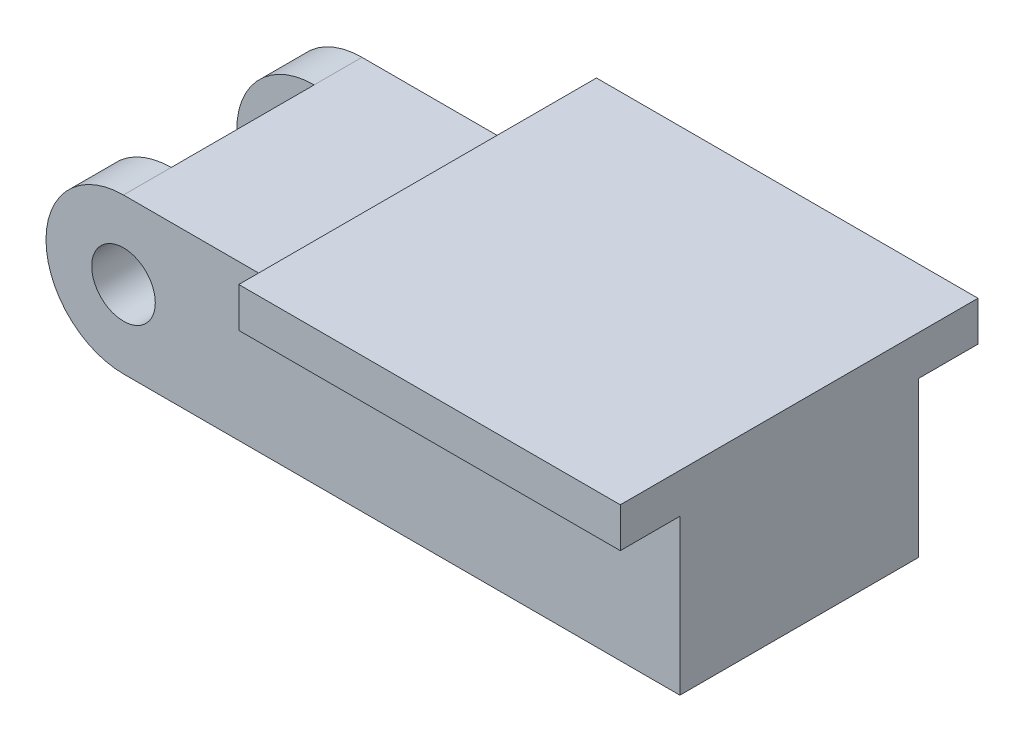
ISO-10303-21;
HEADER;
FILE_DESCRIPTION(('STEP AP214'),'2;1');
FILE_NAME('part.step','',(''),(''),'','','');
FILE_SCHEMA(('AUTOMOTIVE_DESIGN { 1 0 10303 214 1 1 1 1 }'));
ENDSEC;
DATA;
#1=APPLICATION_CONTEXT('core data for automotive mechanical design processes');
#2=APPLICATION_PROTOCOL_DEFINITION('international standard','automotive_design',2000,#1);
#3=PRODUCT_CONTEXT('',#1,'mechanical');
#4=PRODUCT('Part','Part','',(#3));
#5=PRODUCT_RELATED_PRODUCT_CATEGORY('part','',(#4));
#6=PRODUCT_DEFINITION_FORMATION('','',#4);
#7=PRODUCT_DEFINITION_CONTEXT('part definition',#1,'design');
#8=PRODUCT_DEFINITION('design','',#6,#7);
#9=PRODUCT_DEFINITION_SHAPE('','',#8);
#10=(LENGTH_UNIT() NAMED_UNIT(*) SI_UNIT(.MILLI.,.METRE.));
#11=(NAMED_UNIT(*) PLANE_ANGLE_UNIT() SI_UNIT($,.RADIAN.));
#12=(NAMED_UNIT(*) SI_UNIT($,.STERADIAN.) SOLID_ANGLE_UNIT());
#13=UNCERTAINTY_MEASURE_WITH_UNIT(LENGTH_MEASURE(1.E-05),#10,'distance_accuracy_value','');
#14=(GEOMETRIC_REPRESENTATION_CONTEXT(3) GLOBAL_UNCERTAINTY_ASSIGNED_CONTEXT((#13)) GLOBAL_UNIT_ASSIGNED_CONTEXT((#10,
#11,#12)) REPRESENTATION_CONTEXT('',''));
#15=CARTESIAN_POINT('',(0.,0.,0.));
#16=DIRECTION('',(0.,0.,1.));
#17=DIRECTION('',(1.,0.,0.));
#18=AXIS2_PLACEMENT_3D('',#15,#16,#17);
#19=CARTESIAN_POINT('',(-70.,0.,15.));
#20=DIRECTION('',(0.,-1.,0.));
#21=DIRECTION('',(0.,0.,-1.));
#22=AXIS2_PLACEMENT_3D('',#19,#20,#21);
#23=PLANE('',#22);
#24=CARTESIAN_POINT('',(-24.,0.,0.));
#25=DIRECTION('',(0.,-1.,0.));
#26=DIRECTION('',(0.,0.,-1.));
#27=AXIS2_PLACEMENT_3D('',#24,#25,#26);
#28=CIRCLE('',#27,9.);
#29=CARTESIAN_POINT('',(-24.,0.,-9.00000000000001));
#30=VERTEX_POINT('',#29);
#31=EDGE_CURVE('E155',#30,#30,#28,.T.);
#32=ORIENTED_EDGE('',*,*,#31,.F.);
#33=EDGE_LOOP('',(#32));
#34=FACE_BOUND('',#33,.T.);
#35=DIRECTION('',(0.,0.,-1.));
#36=VECTOR('',#35,1.);
#37=CARTESIAN_POINT('',(-70.,0.,15.));
#38=LINE('',#37,#36);
#39=CARTESIAN_POINT('',(-70.,0.,15.));
#40=VERTEX_POINT('',#39);
#41=CARTESIAN_POINT('',(-70.,0.,9.));
#42=VERTEX_POINT('',#41);
#43=EDGE_CURVE('E159',#40,#42,#38,.T.);
#44=ORIENTED_EDGE('',*,*,#43,.T.);
#45=DIRECTION('',(-1.,0.,0.));
#46=VECTOR('',#45,1.);
#47=CARTESIAN_POINT('',(-45.,0.,9.));
#48=LINE('',#47,#46);
#49=CARTESIAN_POINT('',(-45.,0.,9.));
#50=VERTEX_POINT('',#49);
#51=EDGE_CURVE('E145',#50,#42,#48,.T.);
#52=ORIENTED_EDGE('',*,*,#51,.F.);
#53=DIRECTION('',(0.,0.,-1.));
#54=VECTOR('',#53,1.);
#55=CARTESIAN_POINT('',(-45.,0.,9.));
#56=LINE('',#55,#54);
#57=CARTESIAN_POINT('',(-45.,0.,-9.));
#58=VERTEX_POINT('',#57);
#59=EDGE_CURVE('E150',#50,#58,#56,.T.);
#60=ORIENTED_EDGE('',*,*,#59,.T.);
#61=DIRECTION('',(-1.,0.,0.));
#62=VECTOR('',#61,1.);
#63=CARTESIAN_POINT('',(-45.,0.,-9.));
#64=LINE('',#63,#62);
#65=CARTESIAN_POINT('',(-70.,0.,-9.));
#66=VERTEX_POINT('',#65);
#67=EDGE_CURVE('E147',#58,#66,#64,.T.);
#68=ORIENTED_EDGE('',*,*,#67,.T.);
#69=CARTESIAN_POINT('',(-70.,0.,-15.));
#70=VERTEX_POINT('',#69);
#71=EDGE_CURVE('E234',#66,#70,#38,.T.);
#72=ORIENTED_EDGE('',*,*,#71,.T.);
#73=DIRECTION('',(1.,0.,0.));
#74=VECTOR('',#73,1.);
#75=CARTESIAN_POINT('',(-70.,0.,-15.));
#76=LINE('',#75,#74);
#77=CARTESIAN_POINT('',(0.,0.,-15.));
#78=VERTEX_POINT('',#77);
#79=EDGE_CURVE('E255',#70,#78,#76,.T.);
#80=ORIENTED_EDGE('',*,*,#79,.T.);
#81=DIRECTION('',(0.,0.,-1.));
#82=VECTOR('',#81,1.);
#83=CARTESIAN_POINT('',(0.,0.,15.));
#84=LINE('',#83,#82);
#85=CARTESIAN_POINT('',(0.,0.,15.));
#86=VERTEX_POINT('',#85);
#87=EDGE_CURVE('E242',#86,#78,#84,.T.);
#88=ORIENTED_EDGE('',*,*,#87,.F.);
#89=DIRECTION('',(1.,0.,0.));
#90=VECTOR('',#89,1.);
#91=CARTESIAN_POINT('',(-70.,0.,15.));
#92=LINE('',#91,#90);
#93=EDGE_CURVE('E238',#40,#86,#92,.T.);
#94=ORIENTED_EDGE('',*,*,#93,.F.);
#95=EDGE_LOOP('',(#44,#52,#60,#68,#72,#80,#88,#94));
#96=FACE_BOUND('',#95,.T.);
#97=ADVANCED_FACE('F43',(#34,#96),#23,.T.);
#98=CARTESIAN_POINT('',(-70.,9.75,-36.801662780623));
#99=DIRECTION('',(0.,0.,1.));
#100=DIRECTION('',(1.,0.,0.));
#101=AXIS2_PLACEMENT_3D('',#98,#99,#100);
#102=CYLINDRICAL_SURFACE('',#101,9.75);
#103=CARTESIAN_POINT('',(-70.,9.75,-9.));
#104=DIRECTION('',(0.,0.,-1.));
#105=DIRECTION('',(0.,1.,0.));
#106=AXIS2_PLACEMENT_3D('',#103,#104,#105);
#107=CIRCLE('',#106,9.75000000000001);
#108=CARTESIAN_POINT('',(-70.,19.5,-9.));
#109=VERTEX_POINT('',#108);
#110=EDGE_CURVE('E183',#109,#66,#107,.F.);
#111=ORIENTED_EDGE('',*,*,#110,.F.);
#112=DIRECTION('',(0.,0.,1.));
#113=VECTOR('',#112,1.);
#114=CARTESIAN_POINT('',(-70.,19.5,15.));
#115=LINE('',#114,#113);
#116=CARTESIAN_POINT('',(-70.,19.5,-15.));
#117=VERTEX_POINT('',#116);
#118=EDGE_CURVE('E235',#117,#109,#115,.T.);
#119=ORIENTED_EDGE('',*,*,#118,.F.);
#120=CARTESIAN_POINT('',(-70.,9.75,-15.));
#121=DIRECTION('',(0.,0.,-1.));
#122=DIRECTION('',(0.,1.,0.));
#123=AXIS2_PLACEMENT_3D('',#120,#121,#122);
#124=CIRCLE('',#123,9.75);
#125=EDGE_CURVE('E228',#117,#70,#124,.F.);
#126=ORIENTED_EDGE('',*,*,#125,.T.);
#127=ORIENTED_EDGE('',*,*,#71,.F.);
#128=EDGE_LOOP('',(#111,#119,#126,#127));
#129=FACE_BOUND('',#128,.T.);
#130=ADVANCED_FACE('F282',(#129),#102,.T.);
#131=CARTESIAN_POINT('',(-70.,19.5,15.));
#132=DIRECTION('',(0.,1.,0.));
#133=DIRECTION('',(0.,0.,1.));
#134=AXIS2_PLACEMENT_3D('',#131,#132,#133);
#135=PLANE('',#134);
#136=DIRECTION('',(1.,0.,0.));
#137=VECTOR('',#136,1.);
#138=CARTESIAN_POINT('',(-70.,19.5,15.));
#139=LINE('',#138,#137);
#140=CARTESIAN_POINT('',(-70.,19.5,15.));
#141=VERTEX_POINT('',#140);
#142=CARTESIAN_POINT('',(-48.,19.5,15.));
#143=VERTEX_POINT('',#142);
#144=EDGE_CURVE('E248',#141,#143,#139,.T.);
#145=ORIENTED_EDGE('',*,*,#144,.T.);
#146=DIRECTION('',(0.,0.,1.));
#147=VECTOR('',#146,1.);
#148=CARTESIAN_POINT('',(-48.,19.5,-22.5));
#149=LINE('',#148,#147);
#150=CARTESIAN_POINT('',(-48.,19.5,-15.));
#151=VERTEX_POINT('',#150);
#152=EDGE_CURVE('E202',#151,#143,#149,.T.);
#153=ORIENTED_EDGE('',*,*,#152,.F.);
#154=DIRECTION('',(1.,0.,0.));
#155=VECTOR('',#154,1.);
#156=CARTESIAN_POINT('',(-70.,19.5,-15.));
#157=LINE('',#156,#155);
#158=EDGE_CURVE('E252',#117,#151,#157,.T.);
#159=ORIENTED_EDGE('',*,*,#158,.F.);
#160=ORIENTED_EDGE('',*,*,#118,.T.);
#161=CARTESIAN_POINT('',(-70.,19.5,9.));
#162=VERTEX_POINT('',#161);
#163=EDGE_CURVE('E239',#109,#162,#115,.T.);
#164=ORIENTED_EDGE('',*,*,#163,.T.);
#165=EDGE_CURVE('E233',#162,#141,#115,.T.);
#166=ORIENTED_EDGE('',*,*,#165,.T.);
#167=EDGE_LOOP('',(#145,#153,#159,#160,#164,#166));
#168=FACE_BOUND('',#167,.T.);
#169=ADVANCED_FACE('F276',(#168),#135,.T.);
#170=CARTESIAN_POINT('',(-70.,0.,15.));
#171=DIRECTION('',(0.,0.,1.));
#172=DIRECTION('',(0.,-1.,0.));
#173=AXIS2_PLACEMENT_3D('',#170,#171,#172);
#174=PLANE('',#173);
#175=CARTESIAN_POINT('',(-70.,9.75,15.));
#176=DIRECTION('',(0.,0.,1.));
#177=DIRECTION('',(1.,0.,0.));
#178=AXIS2_PLACEMENT_3D('',#175,#176,#177);
#179=CIRCLE('',#178,4.00000000000001);
#180=CARTESIAN_POINT('',(-65.9999999999999,9.75,15.));
#181=VERTEX_POINT('',#180);
#182=EDGE_CURVE('E167',#181,#181,#179,.T.);
#183=ORIENTED_EDGE('',*,*,#182,.F.);
#184=EDGE_LOOP('',(#183));
#185=FACE_BOUND('',#184,.T.);
#186=DIRECTION('',(0.,-1.,0.));
#187=VECTOR('',#186,1.);
#188=CARTESIAN_POINT('',(0.,0.,15.));
#189=LINE('',#188,#187);
#190=CARTESIAN_POINT('',(0.,19.5,15.));
#191=VERTEX_POINT('',#190);
#192=EDGE_CURVE('E231',#191,#86,#189,.T.);
#193=ORIENTED_EDGE('',*,*,#192,.F.);
#194=DIRECTION('',(-1.,0.,0.));
#195=VECTOR('',#194,1.);
#196=CARTESIAN_POINT('',(-70.,19.5,15.));
#197=LINE('',#196,#195);
#198=EDGE_CURVE('E222',#191,#143,#197,.T.);
#199=ORIENTED_EDGE('',*,*,#198,.T.);
#200=ORIENTED_EDGE('',*,*,#144,.F.);
#201=CARTESIAN_POINT('',(-70.,9.75,15.));
#202=DIRECTION('',(0.,0.,1.));
#203=DIRECTION('',(1.,0.,0.));
#204=AXIS2_PLACEMENT_3D('',#201,#202,#203);
#205=CIRCLE('',#204,9.75);
#206=EDGE_CURVE('E225',#141,#40,#205,.T.);
#207=ORIENTED_EDGE('',*,*,#206,.T.);
#208=ORIENTED_EDGE('',*,*,#93,.T.);
#209=EDGE_LOOP('',(#193,#199,#200,#207,#208));
#210=FACE_BOUND('',#209,.T.);
#211=ADVANCED_FACE('F303',(#185,#210),#174,.T.);
#212=CARTESIAN_POINT('',(-70.,0.,-15.));
#213=DIRECTION('',(0.,0.,-1.));
#214=DIRECTION('',(0.,1.,0.));
#215=AXIS2_PLACEMENT_3D('',#212,#213,#214);
#216=PLANE('',#215);
#217=CARTESIAN_POINT('',(-70.,9.75,-15.));
#218=DIRECTION('',(0.,0.,-1.));
#219=DIRECTION('',(0.,1.,0.));
#220=AXIS2_PLACEMENT_3D('',#217,#218,#219);
#221=CIRCLE('',#220,4.00000000000001);
#222=CARTESIAN_POINT('',(-70.,13.75,-15.));
#223=VERTEX_POINT('',#222);
#224=EDGE_CURVE('E176',#223,#223,#221,.T.);
#225=ORIENTED_EDGE('',*,*,#224,.F.);
#226=EDGE_LOOP('',(#225));
#227=FACE_BOUND('',#226,.T.);
#228=DIRECTION('',(0.,1.,0.));
#229=VECTOR('',#228,1.);
#230=CARTESIAN_POINT('',(0.,0.,-15.));
#231=LINE('',#230,#229);
#232=CARTESIAN_POINT('',(0.,19.5,-15.));
#233=VERTEX_POINT('',#232);
#234=EDGE_CURVE('E245',#78,#233,#231,.T.);
#235=ORIENTED_EDGE('',*,*,#234,.F.);
#236=ORIENTED_EDGE('',*,*,#79,.F.);
#237=ORIENTED_EDGE('',*,*,#125,.F.);
#238=ORIENTED_EDGE('',*,*,#158,.T.);
#239=DIRECTION('',(1.,0.,0.));
#240=VECTOR('',#239,1.);
#241=CARTESIAN_POINT('',(-70.,19.5,-15.));
#242=LINE('',#241,#240);
#243=EDGE_CURVE('E219',#151,#233,#242,.T.);
#244=ORIENTED_EDGE('',*,*,#243,.T.);
#245=EDGE_LOOP('',(#235,#236,#237,#238,#244));
#246=FACE_BOUND('',#245,.T.);
#247=ADVANCED_FACE('F301',(#227,#246),#216,.T.);
#248=CARTESIAN_POINT('',(0.,0.,0.));
#249=DIRECTION('',(-1.,0.,0.));
#250=DIRECTION('',(0.,0.,1.));
#251=AXIS2_PLACEMENT_3D('',#248,#249,#250);
#252=PLANE('',#251);
#253=ORIENTED_EDGE('',*,*,#192,.T.);
#254=ORIENTED_EDGE('',*,*,#87,.T.);
#255=ORIENTED_EDGE('',*,*,#234,.T.);
#256=DIRECTION('',(0.,0.,-1.));
#257=VECTOR('',#256,1.);
#258=CARTESIAN_POINT('',(0.,19.5,-22.5));
#259=LINE('',#258,#257);
#260=CARTESIAN_POINT('',(0.,19.5,-22.5));
#261=VERTEX_POINT('',#260);
#262=EDGE_CURVE('E204',#233,#261,#259,.T.);
#263=ORIENTED_EDGE('',*,*,#262,.T.);
#264=DIRECTION('',(0.,-1.,0.));
#265=VECTOR('',#264,1.);
#266=CARTESIAN_POINT('',(0.,24.5,-22.5));
#267=LINE('',#266,#265);
#268=CARTESIAN_POINT('',(0.,24.5,-22.5));
#269=VERTEX_POINT('',#268);
#270=EDGE_CURVE('E210',#269,#261,#267,.T.);
#271=ORIENTED_EDGE('',*,*,#270,.F.);
#272=DIRECTION('',(0.,0.,-1.));
#273=VECTOR('',#272,1.);
#274=CARTESIAN_POINT('',(0.,24.5,-22.5));
#275=LINE('',#274,#273);
#276=CARTESIAN_POINT('',(0.,24.5,22.5));
#277=VERTEX_POINT('',#276);
#278=EDGE_CURVE('E193',#277,#269,#275,.T.);
#279=ORIENTED_EDGE('',*,*,#278,.F.);
#280=DIRECTION('',(0.,-1.,0.));
#281=VECTOR('',#280,1.);
#282=CARTESIAN_POINT('',(0.,24.5,22.5));
#283=LINE('',#282,#281);
#284=CARTESIAN_POINT('',(0.,19.5,22.5));
#285=VERTEX_POINT('',#284);
#286=EDGE_CURVE('E213',#277,#285,#283,.T.);
#287=ORIENTED_EDGE('',*,*,#286,.T.);
#288=EDGE_CURVE('E205',#285,#191,#259,.T.);
#289=ORIENTED_EDGE('',*,*,#288,.T.);
#290=EDGE_LOOP('',(#253,#254,#255,#263,#271,#279,#287,#289));
#291=FACE_BOUND('',#290,.T.);
#292=ADVANCED_FACE('F310',(#291),#252,.F.);
#293=CARTESIAN_POINT('',(-70.,9.75,9.));
#294=DIRECTION('',(0.,0.,1.));
#295=DIRECTION('',(1.,0.,0.));
#296=AXIS2_PLACEMENT_3D('',#293,#294,#295);
#297=CIRCLE('',#296,9.75000000000001);
#298=EDGE_CURVE('E180',#162,#42,#297,.T.);
#299=ORIENTED_EDGE('',*,*,#298,.T.);
#300=ORIENTED_EDGE('',*,*,#43,.F.);
#301=ORIENTED_EDGE('',*,*,#206,.F.);
#302=ORIENTED_EDGE('',*,*,#165,.F.);
#303=EDGE_LOOP('',(#299,#300,#301,#302));
#304=FACE_BOUND('',#303,.T.);
#305=ADVANCED_FACE('F273',(#304),#102,.T.);
#306=CARTESIAN_POINT('',(0.,19.5,0.));
#307=DIRECTION('',(0.,1.,0.));
#308=DIRECTION('',(0.,0.,1.));
#309=AXIS2_PLACEMENT_3D('',#306,#307,#308);
#310=PLANE('',#309);
#311=ORIENTED_EDGE('',*,*,#198,.F.);
#312=ORIENTED_EDGE('',*,*,#288,.F.);
#313=DIRECTION('',(1.,0.,0.));
#314=VECTOR('',#313,1.);
#315=CARTESIAN_POINT('',(-48.,19.5,22.5));
#316=LINE('',#315,#314);
#317=CARTESIAN_POINT('',(-48.,19.5,22.5));
#318=VERTEX_POINT('',#317);
#319=EDGE_CURVE('E201',#318,#285,#316,.T.);
#320=ORIENTED_EDGE('',*,*,#319,.F.);
#321=EDGE_CURVE('E186',#143,#318,#149,.T.);
#322=ORIENTED_EDGE('',*,*,#321,.F.);
#323=EDGE_LOOP('',(#311,#312,#320,#322));
#324=FACE_BOUND('',#323,.T.);
#325=ADVANCED_FACE('F323',(#324),#310,.F.);
#326=CARTESIAN_POINT('',(-48.,24.5,-22.5));
#327=DIRECTION('',(1.,0.,0.));
#328=DIRECTION('',(0.,0.,-1.));
#329=AXIS2_PLACEMENT_3D('',#326,#327,#328);
#330=PLANE('',#329);
#331=CARTESIAN_POINT('',(-48.,19.5,-22.5));
#332=VERTEX_POINT('',#331);
#333=EDGE_CURVE('E198',#332,#151,#149,.T.);
#334=ORIENTED_EDGE('',*,*,#333,.T.);
#335=ORIENTED_EDGE('',*,*,#152,.T.);
#336=ORIENTED_EDGE('',*,*,#321,.T.);
#337=DIRECTION('',(0.,-1.,0.));
#338=VECTOR('',#337,1.);
#339=CARTESIAN_POINT('',(-48.,24.5,22.5));
#340=LINE('',#339,#338);
#341=CARTESIAN_POINT('',(-48.,24.5,22.5));
#342=VERTEX_POINT('',#341);
#343=EDGE_CURVE('E216',#342,#318,#340,.T.);
#344=ORIENTED_EDGE('',*,*,#343,.F.);
#345=DIRECTION('',(0.,0.,1.));
#346=VECTOR('',#345,1.);
#347=CARTESIAN_POINT('',(-48.,24.5,-22.5));
#348=LINE('',#347,#346);
#349=CARTESIAN_POINT('',(-48.,24.5,-22.5));
#350=VERTEX_POINT('',#349);
#351=EDGE_CURVE('E187',#350,#342,#348,.T.);
#352=ORIENTED_EDGE('',*,*,#351,.F.);
#353=DIRECTION('',(0.,-1.,0.));
#354=VECTOR('',#353,1.);
#355=CARTESIAN_POINT('',(-48.,24.5,-22.5));
#356=LINE('',#355,#354);
#357=EDGE_CURVE('E197',#350,#332,#356,.T.);
#358=ORIENTED_EDGE('',*,*,#357,.T.);
#359=EDGE_LOOP('',(#334,#335,#336,#344,#352,#358));
#360=FACE_BOUND('',#359,.T.);
#361=ADVANCED_FACE('F328',(#360),#330,.F.);
#362=CARTESIAN_POINT('',(-48.,24.5,22.5));
#363=DIRECTION('',(0.,0.,-1.));
#364=DIRECTION('',(0.,1.,0.));
#365=AXIS2_PLACEMENT_3D('',#362,#363,#364);
#366=PLANE('',#365);
#367=ORIENTED_EDGE('',*,*,#319,.T.);
#368=ORIENTED_EDGE('',*,*,#286,.F.);
#369=DIRECTION('',(1.,0.,0.));
#370=VECTOR('',#369,1.);
#371=CARTESIAN_POINT('',(-48.,24.5,22.5));
#372=LINE('',#371,#370);
#373=EDGE_CURVE('E190',#342,#277,#372,.T.);
#374=ORIENTED_EDGE('',*,*,#373,.F.);
#375=ORIENTED_EDGE('',*,*,#343,.T.);
#376=EDGE_LOOP('',(#367,#368,#374,#375));
#377=FACE_BOUND('',#376,.T.);
#378=ADVANCED_FACE('F357',(#377),#366,.F.);
#379=CARTESIAN_POINT('',(-48.,24.5,-22.5));
#380=DIRECTION('',(0.,0.,1.));
#381=DIRECTION('',(1.,0.,0.));
#382=AXIS2_PLACEMENT_3D('',#379,#380,#381);
#383=PLANE('',#382);
#384=DIRECTION('',(-1.,0.,0.));
#385=VECTOR('',#384,1.);
#386=CARTESIAN_POINT('',(-48.,19.5,-22.5));
#387=LINE('',#386,#385);
#388=EDGE_CURVE('E191',#261,#332,#387,.T.);
#389=ORIENTED_EDGE('',*,*,#388,.T.);
#390=ORIENTED_EDGE('',*,*,#357,.F.);
#391=DIRECTION('',(-1.,0.,0.));
#392=VECTOR('',#391,1.);
#393=CARTESIAN_POINT('',(-48.,24.5,-22.5));
#394=LINE('',#393,#392);
#395=EDGE_CURVE('E195',#269,#350,#394,.T.);
#396=ORIENTED_EDGE('',*,*,#395,.F.);
#397=ORIENTED_EDGE('',*,*,#270,.T.);
#398=EDGE_LOOP('',(#389,#390,#396,#397));
#399=FACE_BOUND('',#398,.T.);
#400=ADVANCED_FACE('F338',(#399),#383,.F.);
#401=CARTESIAN_POINT('',(0.,24.5,0.));
#402=DIRECTION('',(0.,1.,0.));
#403=DIRECTION('',(0.,0.,1.));
#404=AXIS2_PLACEMENT_3D('',#401,#402,#403);
#405=PLANE('',#404);
#406=ORIENTED_EDGE('',*,*,#351,.T.);
#407=ORIENTED_EDGE('',*,*,#373,.T.);
#408=ORIENTED_EDGE('',*,*,#278,.T.);
#409=ORIENTED_EDGE('',*,*,#395,.T.);
#410=EDGE_LOOP('',(#406,#407,#408,#409));
#411=FACE_BOUND('',#410,.T.);
#412=ADVANCED_FACE('F342',(#411),#405,.T.);
#413=ORIENTED_EDGE('',*,*,#243,.F.);
#414=ORIENTED_EDGE('',*,*,#333,.F.);
#415=ORIENTED_EDGE('',*,*,#388,.F.);
#416=ORIENTED_EDGE('',*,*,#262,.F.);
#417=EDGE_LOOP('',(#413,#414,#415,#416));
#418=FACE_BOUND('',#417,.T.);
#419=ADVANCED_FACE('F340',(#418),#310,.F.);
#420=CARTESIAN_POINT('',(-70.,9.75,-42.5771644662754));
#421=DIRECTION('',(0.,0.,1.));
#422=DIRECTION('',(1.,0.,0.));
#423=AXIS2_PLACEMENT_3D('',#420,#421,#422);
#424=CYLINDRICAL_SURFACE('',#423,9.75000000000001);
#425=CARTESIAN_POINT('',(-60.548646280554,12.1446634147442,-9.));
#426=VERTEX_POINT('',#425);
#427=EDGE_CURVE('E182',#426,#109,#107,.F.);
#428=ORIENTED_EDGE('',*,*,#427,.F.);
#429=DIRECTION('',(0.,0.,1.));
#430=VECTOR('',#429,1.);
#431=CARTESIAN_POINT('',(-60.548646280554,12.1446634147442,-42.5771644662754));
#432=LINE('',#431,#430);
#433=CARTESIAN_POINT('',(-60.548646280554,12.1446634147442,9.));
#434=VERTEX_POINT('',#433);
#435=EDGE_CURVE('E251',#426,#434,#432,.T.);
#436=ORIENTED_EDGE('',*,*,#435,.T.);
#437=EDGE_CURVE('E179',#434,#162,#297,.T.);
#438=ORIENTED_EDGE('',*,*,#437,.T.);
#439=ORIENTED_EDGE('',*,*,#163,.F.);
#440=EDGE_LOOP('',(#428,#436,#438,#439));
#441=FACE_BOUND('',#440,.T.);
#442=ADVANCED_FACE('F265',(#441),#424,.F.);
#443=CARTESIAN_POINT('',(-70.,0.,-9.));
#444=DIRECTION('',(0.,0.,-1.));
#445=DIRECTION('',(0.,1.,0.));
#446=AXIS2_PLACEMENT_3D('',#443,#444,#445);
#447=PLANE('',#446);
#448=CARTESIAN_POINT('',(-70.,9.75,-9.));
#449=DIRECTION('',(0.,0.,-1.));
#450=DIRECTION('',(0.,1.,0.));
#451=AXIS2_PLACEMENT_3D('',#448,#449,#450);
#452=CIRCLE('',#451,4.00000000000001);
#453=CARTESIAN_POINT('',(-70.,13.75,-9.));
#454=VERTEX_POINT('',#453);
#455=EDGE_CURVE('E173',#454,#454,#452,.T.);
#456=ORIENTED_EDGE('',*,*,#455,.T.);
#457=EDGE_LOOP('',(#456));
#458=FACE_BOUND('',#457,.T.);
#459=ORIENTED_EDGE('',*,*,#110,.T.);
#460=ORIENTED_EDGE('',*,*,#67,.F.);
#461=DIRECTION('',(0.877332396960638,-0.479883178745933,0.));
#462=VECTOR('',#461,1.);
#463=CARTESIAN_POINT('',(-66.5615043549662,11.7937092990647,-9.));
#464=LINE('',#463,#462);
#465=CARTESIAN_POINT('',(-55.6537819455046,5.8274044859011,-9.));
#466=VERTEX_POINT('',#465);
#467=EDGE_CURVE('E152',#466,#58,#464,.T.);
#468=ORIENTED_EDGE('',*,*,#467,.F.);
#469=CARTESIAN_POINT('',(-50.8549501580453,14.6007284555075,-9.));
#470=DIRECTION('',(0.,0.,-1.));
#471=DIRECTION('',(0.,1.,0.));
#472=AXIS2_PLACEMENT_3D('',#469,#470,#471);
#473=CIRCLE('',#472,10.);
#474=EDGE_CURVE('E12',#466,#426,#473,.T.);
#475=ORIENTED_EDGE('',*,*,#474,.T.);
#476=ORIENTED_EDGE('',*,*,#427,.T.);
#477=EDGE_LOOP('',(#459,#460,#468,#475,#476));
#478=FACE_BOUND('',#477,.T.);
#479=ADVANCED_FACE('F284',(#458,#478),#447,.F.);
#480=CARTESIAN_POINT('',(-70.,9.75,9.));
#481=DIRECTION('',(0.,0.,1.));
#482=DIRECTION('',(1.,0.,0.));
#483=AXIS2_PLACEMENT_3D('',#480,#481,#482);
#484=PLANE('',#483);
#485=ORIENTED_EDGE('',*,*,#437,.F.);
#486=CARTESIAN_POINT('',(-50.8549501580453,14.6007284555075,9.));
#487=DIRECTION('',(0.,0.,1.));
#488=DIRECTION('',(1.,0.,0.));
#489=AXIS2_PLACEMENT_3D('',#486,#487,#488);
#490=CIRCLE('',#489,10.);
#491=CARTESIAN_POINT('',(-55.6537819455046,5.8274044859011,9.));
#492=VERTEX_POINT('',#491);
#493=EDGE_CURVE('E51',#434,#492,#490,.T.);
#494=ORIENTED_EDGE('',*,*,#493,.T.);
#495=DIRECTION('',(0.877332396960638,-0.479883178745933,0.));
#496=VECTOR('',#495,1.);
#497=CARTESIAN_POINT('',(-66.5615043549662,11.7937092990647,9.));
#498=LINE('',#497,#496);
#499=EDGE_CURVE('E139',#492,#50,#498,.T.);
#500=ORIENTED_EDGE('',*,*,#499,.T.);
#501=ORIENTED_EDGE('',*,*,#51,.T.);
#502=ORIENTED_EDGE('',*,*,#298,.F.);
#503=EDGE_LOOP('',(#485,#494,#500,#501,#502));
#504=FACE_BOUND('',#503,.T.);
#505=CARTESIAN_POINT('',(-70.,9.75,9.));
#506=DIRECTION('',(0.,0.,1.));
#507=DIRECTION('',(1.,0.,0.));
#508=AXIS2_PLACEMENT_3D('',#505,#506,#507);
#509=CIRCLE('',#508,4.00000000000001);
#510=CARTESIAN_POINT('',(-65.9999999999999,9.75,9.));
#511=VERTEX_POINT('',#510);
#512=EDGE_CURVE('E172',#511,#511,#509,.T.);
#513=ORIENTED_EDGE('',*,*,#512,.T.);
#514=EDGE_LOOP('',(#513));
#515=FACE_BOUND('',#514,.T.);
#516=ADVANCED_FACE('F141',(#504,#515),#484,.F.);
#517=CARTESIAN_POINT('',(-70.,9.75,-22.5));
#518=DIRECTION('',(0.,0.,1.));
#519=DIRECTION('',(1.,0.,0.));
#520=AXIS2_PLACEMENT_3D('',#517,#518,#519);
#521=CYLINDRICAL_SURFACE('',#520,4.00000000000001);
#522=ORIENTED_EDGE('',*,*,#182,.T.);
#523=EDGE_LOOP('',(#522));
#524=FACE_BOUND('',#523,.T.);
#525=ORIENTED_EDGE('',*,*,#512,.F.);
#526=EDGE_LOOP('',(#525));
#527=FACE_BOUND('',#526,.T.);
#528=ADVANCED_FACE('F416',(#524,#527),#521,.F.);
#529=ORIENTED_EDGE('',*,*,#224,.T.);
#530=EDGE_LOOP('',(#529));
#531=FACE_BOUND('',#530,.T.);
#532=ORIENTED_EDGE('',*,*,#455,.F.);
#533=EDGE_LOOP('',(#532));
#534=FACE_BOUND('',#533,.T.);
#535=ADVANCED_FACE('F426',(#531,#534),#521,.F.);
#536=CARTESIAN_POINT('',(-24.,10.,0.));
#537=DIRECTION('',(0.,-1.,0.));
#538=DIRECTION('',(0.,0.,-1.));
#539=AXIS2_PLACEMENT_3D('',#536,#537,#538);
#540=CYLINDRICAL_SURFACE('',#539,9.);
#541=CARTESIAN_POINT('',(-24.,10.,0.));
#542=DIRECTION('',(0.,-1.,0.));
#543=DIRECTION('',(0.,0.,-1.));
#544=AXIS2_PLACEMENT_3D('',#541,#542,#543);
#545=CIRCLE('',#544,9.);
#546=CARTESIAN_POINT('',(-24.,10.,-9.00000000000001));
#547=VERTEX_POINT('',#546);
#548=EDGE_CURVE('E164',#547,#547,#545,.T.);
#549=ORIENTED_EDGE('',*,*,#548,.F.);
#550=EDGE_LOOP('',(#549));
#551=FACE_BOUND('',#550,.T.);
#552=ORIENTED_EDGE('',*,*,#31,.T.);
#553=EDGE_LOOP('',(#552));
#554=FACE_BOUND('',#553,.T.);
#555=ADVANCED_FACE('F435',(#551,#554),#540,.F.);
#556=CARTESIAN_POINT('',(-24.,10.,0.));
#557=DIRECTION('',(0.,-1.,0.));
#558=DIRECTION('',(0.,0.,-1.));
#559=AXIS2_PLACEMENT_3D('',#556,#557,#558);
#560=PLANE('',#559);
#561=ORIENTED_EDGE('',*,*,#548,.T.);
#562=EDGE_LOOP('',(#561));
#563=FACE_BOUND('',#562,.T.);
#564=ADVANCED_FACE('F289',(#563),#560,.T.);
#565=CARTESIAN_POINT('',(-66.5615043549662,11.7937092990647,9.));
#566=DIRECTION('',(0.479883178745933,0.877332396960638,0.));
#567=DIRECTION('',(-0.877332396960638,0.479883178745933,0.));
#568=AXIS2_PLACEMENT_3D('',#565,#566,#567);
#569=PLANE('',#568);
#570=ORIENTED_EDGE('',*,*,#499,.F.);
#571=DIRECTION('',(0.,0.,1.));
#572=VECTOR('',#571,1.);
#573=CARTESIAN_POINT('',(-55.6537819455046,5.8274044859011,9.));
#574=LINE('',#573,#572);
#575=EDGE_CURVE('E64',#492,#466,#574,.F.);
#576=ORIENTED_EDGE('',*,*,#575,.T.);
#577=ORIENTED_EDGE('',*,*,#467,.T.);
#578=ORIENTED_EDGE('',*,*,#59,.F.);
#579=EDGE_LOOP('',(#570,#576,#577,#578));
#580=FACE_BOUND('',#579,.T.);
#581=ADVANCED_FACE('F151',(#580),#569,.F.);
#582=CARTESIAN_POINT('',(-50.8549501580453,14.6007284555075,-42.5771644662754));
#583=DIRECTION('',(0.,0.,1.));
#584=DIRECTION('',(1.,0.,0.));
#585=AXIS2_PLACEMENT_3D('',#582,#583,#584);
#586=CYLINDRICAL_SURFACE('',#585,10.);
#587=ORIENTED_EDGE('',*,*,#474,.F.);
#588=ORIENTED_EDGE('',*,*,#575,.F.);
#589=ORIENTED_EDGE('',*,*,#493,.F.);
#590=ORIENTED_EDGE('',*,*,#435,.F.);
#591=EDGE_LOOP('',(#587,#588,#589,#590));
#592=FACE_BOUND('',#591,.T.);
#593=ADVANCED_FACE('F45',(#592),#586,.T.);
#594=CLOSED_SHELL('',(#97,#130,#169,#211,#247,#292,#305,#325,#361,#378,#400,#412,#419,#442,#479,
#516,#528,#535,#555,#564,#581,#593));
#595=MANIFOLD_SOLID_BREP('B2',#594);
#596=ADVANCED_BREP_SHAPE_REPRESENTATION('',(#18,#595),#14);
#597=SHAPE_DEFINITION_REPRESENTATION(#9,#596);
ENDSEC;
END-ISO-10303-21;
